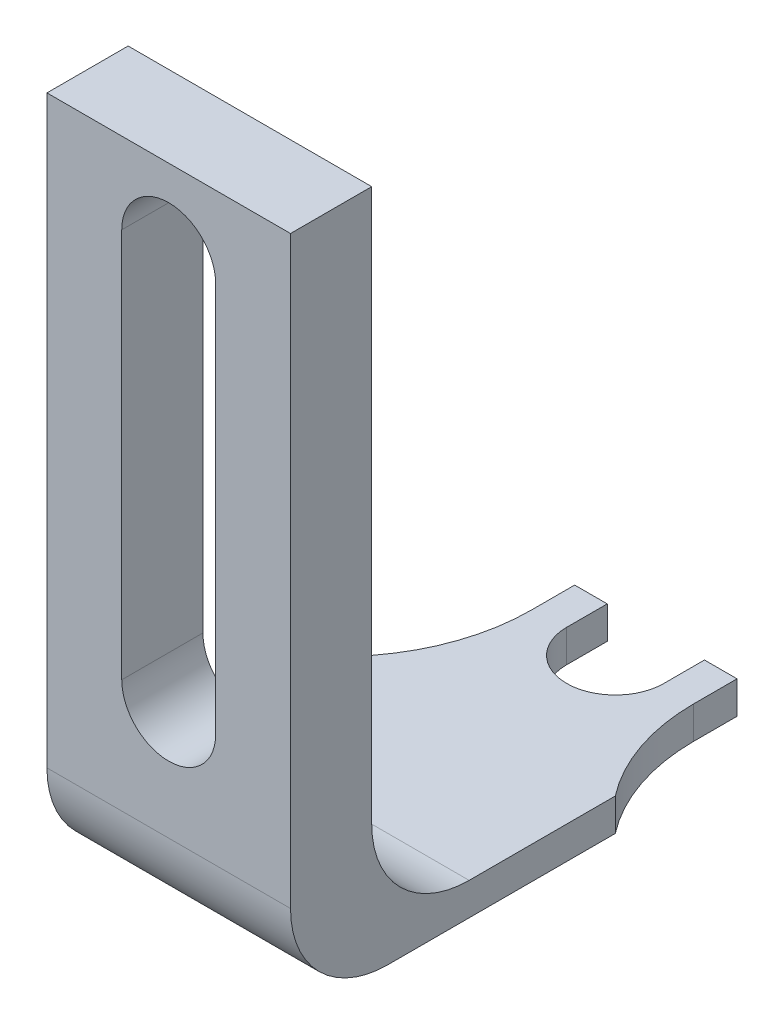
ISO-10303-21;
HEADER;
FILE_DESCRIPTION(('STEP AP214'),'2;1');
FILE_NAME('part.step','',(''),(''),'','','');
FILE_SCHEMA(('AUTOMOTIVE_DESIGN { 1 0 10303 214 1 1 1 1 }'));
ENDSEC;
DATA;
#1=APPLICATION_CONTEXT('core data for automotive mechanical design processes');
#2=APPLICATION_PROTOCOL_DEFINITION('international standard','automotive_design',2000,#1);
#3=PRODUCT_CONTEXT('',#1,'mechanical');
#4=PRODUCT('Part','Part','',(#3));
#5=PRODUCT_RELATED_PRODUCT_CATEGORY('part','',(#4));
#6=PRODUCT_DEFINITION_FORMATION('','',#4);
#7=PRODUCT_DEFINITION_CONTEXT('part definition',#1,'design');
#8=PRODUCT_DEFINITION('design','',#6,#7);
#9=PRODUCT_DEFINITION_SHAPE('','',#8);
#10=(LENGTH_UNIT() NAMED_UNIT(*) SI_UNIT(.MILLI.,.METRE.));
#11=(NAMED_UNIT(*) PLANE_ANGLE_UNIT() SI_UNIT($,.RADIAN.));
#12=(NAMED_UNIT(*) SI_UNIT($,.STERADIAN.) SOLID_ANGLE_UNIT());
#13=UNCERTAINTY_MEASURE_WITH_UNIT(LENGTH_MEASURE(1.E-05),#10,'distance_accuracy_value','');
#14=(GEOMETRIC_REPRESENTATION_CONTEXT(3) GLOBAL_UNCERTAINTY_ASSIGNED_CONTEXT((#13)) GLOBAL_UNIT_ASSIGNED_CONTEXT((#10,
#11,#12)) REPRESENTATION_CONTEXT('',''));
#15=CARTESIAN_POINT('',(0.,0.,0.));
#16=DIRECTION('',(0.,0.,1.));
#17=DIRECTION('',(1.,0.,0.));
#18=AXIS2_PLACEMENT_3D('',#15,#16,#17);
#19=CARTESIAN_POINT('',(6.34999999999999,13.54,0.));
#20=DIRECTION('',(0.,0.,1.));
#21=DIRECTION('',(1.,0.,0.));
#22=AXIS2_PLACEMENT_3D('',#19,#20,#21);
#23=PLANE('',#22);
#24=DIRECTION('',(-1.,0.,0.));
#25=VECTOR('',#24,1.);
#26=CARTESIAN_POINT('',(6.34999999999999,11.,0.));
#27=LINE('',#26,#25);
#28=CARTESIAN_POINT('',(6.34999999999999,11.,0.));
#29=VERTEX_POINT('',#28);
#30=CARTESIAN_POINT('',(3.80199899999999,11.,0.));
#31=VERTEX_POINT('',#30);
#32=EDGE_CURVE('E249',#29,#31,#27,.T.);
#33=ORIENTED_EDGE('',*,*,#32,.T.);
#34=DIRECTION('',(0.,-1.,0.));
#35=VECTOR('',#34,1.);
#36=CARTESIAN_POINT('',(3.80199899999999,13.54,0.));
#37=LINE('',#36,#35);
#38=CARTESIAN_POINT('',(3.80199899999999,13.54,0.));
#39=VERTEX_POINT('',#38);
#40=EDGE_CURVE('E298',#39,#31,#37,.T.);
#41=ORIENTED_EDGE('',*,*,#40,.F.);
#42=DIRECTION('',(-1.,0.,0.));
#43=VECTOR('',#42,1.);
#44=CARTESIAN_POINT('',(6.34999999999999,13.54,0.));
#45=LINE('',#44,#43);
#46=CARTESIAN_POINT('',(6.34999999999999,13.54,0.));
#47=VERTEX_POINT('',#46);
#48=EDGE_CURVE('E252',#47,#39,#45,.T.);
#49=ORIENTED_EDGE('',*,*,#48,.F.);
#50=DIRECTION('',(0.,-1.,0.));
#51=VECTOR('',#50,1.);
#52=CARTESIAN_POINT('',(6.34999999999999,13.54,0.));
#53=LINE('',#52,#51);
#54=EDGE_CURVE('E269',#47,#29,#53,.T.);
#55=ORIENTED_EDGE('',*,*,#54,.T.);
#56=EDGE_LOOP('',(#33,#41,#49,#55));
#57=FACE_BOUND('',#56,.T.);
#58=ADVANCED_FACE('F42',(#57),#23,.F.);
#59=CARTESIAN_POINT('',(3.80199899999999,13.54,0.));
#60=DIRECTION('',(1.,0.,0.));
#61=DIRECTION('',(0.,1.,0.));
#62=AXIS2_PLACEMENT_3D('',#59,#60,#61);
#63=PLANE('',#62);
#64=DIRECTION('',(0.,0.,1.));
#65=VECTOR('',#64,1.);
#66=CARTESIAN_POINT('',(3.80199899999999,11.,0.));
#67=LINE('',#66,#65);
#68=CARTESIAN_POINT('',(3.80199899999999,11.,3.175));
#69=VERTEX_POINT('',#68);
#70=EDGE_CURVE('E272',#31,#69,#67,.T.);
#71=ORIENTED_EDGE('',*,*,#70,.T.);
#72=DIRECTION('',(0.,-1.,0.));
#73=VECTOR('',#72,1.);
#74=CARTESIAN_POINT('',(3.80199899999999,13.54,3.175));
#75=LINE('',#74,#73);
#76=CARTESIAN_POINT('',(3.80199899999999,13.54,3.175));
#77=VERTEX_POINT('',#76);
#78=EDGE_CURVE('E295',#77,#69,#75,.T.);
#79=ORIENTED_EDGE('',*,*,#78,.F.);
#80=DIRECTION('',(0.,0.,1.));
#81=VECTOR('',#80,1.);
#82=CARTESIAN_POINT('',(3.80199899999999,13.54,0.));
#83=LINE('',#82,#81);
#84=EDGE_CURVE('E255',#39,#77,#83,.T.);
#85=ORIENTED_EDGE('',*,*,#84,.F.);
#86=ORIENTED_EDGE('',*,*,#40,.T.);
#87=EDGE_LOOP('',(#71,#79,#85,#86));
#88=FACE_BOUND('',#87,.T.);
#89=ADVANCED_FACE('F385',(#88),#63,.F.);
#90=CARTESIAN_POINT('',(0.,13.54,3.175));
#91=DIRECTION('',(0.,-1.,0.));
#92=DIRECTION('',(1.,0.,0.));
#93=AXIS2_PLACEMENT_3D('',#90,#91,#92);
#94=CYLINDRICAL_SURFACE('',#93,3.80199899999999);
#95=CARTESIAN_POINT('',(0.,11.,3.175));
#96=DIRECTION('',(0.,-1.,0.));
#97=DIRECTION('',(-1.,0.,0.));
#98=AXIS2_PLACEMENT_3D('',#95,#96,#97);
#99=CIRCLE('',#98,3.80199899999999);
#100=CARTESIAN_POINT('',(-3.801999,11.,3.175));
#101=VERTEX_POINT('',#100);
#102=EDGE_CURVE('E274',#69,#101,#99,.T.);
#103=ORIENTED_EDGE('',*,*,#102,.T.);
#104=DIRECTION('',(0.,-1.,0.));
#105=VECTOR('',#104,1.);
#106=CARTESIAN_POINT('',(-3.801999,13.54,3.175));
#107=LINE('',#106,#105);
#108=CARTESIAN_POINT('',(-3.801999,13.54,3.175));
#109=VERTEX_POINT('',#108);
#110=EDGE_CURVE('E292',#109,#101,#107,.T.);
#111=ORIENTED_EDGE('',*,*,#110,.F.);
#112=CARTESIAN_POINT('',(0.,13.54,3.175));
#113=DIRECTION('',(0.,-1.,0.));
#114=DIRECTION('',(-1.,0.,0.));
#115=AXIS2_PLACEMENT_3D('',#112,#113,#114);
#116=CIRCLE('',#115,3.80199899999999);
#117=EDGE_CURVE('E258',#77,#109,#116,.T.);
#118=ORIENTED_EDGE('',*,*,#117,.F.);
#119=ORIENTED_EDGE('',*,*,#78,.T.);
#120=EDGE_LOOP('',(#103,#111,#118,#119));
#121=FACE_BOUND('',#120,.T.);
#122=ADVANCED_FACE('F388',(#121),#94,.F.);
#123=CARTESIAN_POINT('',(-3.801999,13.54,0.));
#124=DIRECTION('',(-1.,0.,0.));
#125=DIRECTION('',(0.,-1.,0.));
#126=AXIS2_PLACEMENT_3D('',#123,#124,#125);
#127=PLANE('',#126);
#128=DIRECTION('',(0.,0.,-1.));
#129=VECTOR('',#128,1.);
#130=CARTESIAN_POINT('',(-3.801999,11.,0.));
#131=LINE('',#130,#129);
#132=CARTESIAN_POINT('',(-3.801999,11.,0.));
#133=VERTEX_POINT('',#132);
#134=EDGE_CURVE('E276',#101,#133,#131,.T.);
#135=ORIENTED_EDGE('',*,*,#134,.T.);
#136=DIRECTION('',(0.,-1.,0.));
#137=VECTOR('',#136,1.);
#138=CARTESIAN_POINT('',(-3.801999,13.54,0.));
#139=LINE('',#138,#137);
#140=CARTESIAN_POINT('',(-3.801999,13.54,0.));
#141=VERTEX_POINT('',#140);
#142=EDGE_CURVE('E289',#141,#133,#139,.T.);
#143=ORIENTED_EDGE('',*,*,#142,.F.);
#144=DIRECTION('',(0.,0.,-1.));
#145=VECTOR('',#144,1.);
#146=CARTESIAN_POINT('',(-3.801999,13.54,0.));
#147=LINE('',#146,#145);
#148=EDGE_CURVE('E260',#109,#141,#147,.T.);
#149=ORIENTED_EDGE('',*,*,#148,.F.);
#150=ORIENTED_EDGE('',*,*,#110,.T.);
#151=EDGE_LOOP('',(#135,#143,#149,#150));
#152=FACE_BOUND('',#151,.T.);
#153=ADVANCED_FACE('F393',(#152),#127,.F.);
#154=CARTESIAN_POINT('',(-3.801999,13.54,0.));
#155=DIRECTION('',(0.,0.,1.));
#156=DIRECTION('',(1.,0.,0.));
#157=AXIS2_PLACEMENT_3D('',#154,#155,#156);
#158=PLANE('',#157);
#159=DIRECTION('',(-1.,0.,0.));
#160=VECTOR('',#159,1.);
#161=CARTESIAN_POINT('',(-3.801999,11.,0.));
#162=LINE('',#161,#160);
#163=CARTESIAN_POINT('',(-6.35,11.,0.));
#164=VERTEX_POINT('',#163);
#165=EDGE_CURVE('E278',#133,#164,#162,.T.);
#166=ORIENTED_EDGE('',*,*,#165,.T.);
#167=DIRECTION('',(0.,-1.,0.));
#168=VECTOR('',#167,1.);
#169=CARTESIAN_POINT('',(-6.35000000000001,13.54,0.));
#170=LINE('',#169,#168);
#171=CARTESIAN_POINT('',(-6.35000000000001,13.54,0.));
#172=VERTEX_POINT('',#171);
#173=EDGE_CURVE('E286',#172,#164,#170,.T.);
#174=ORIENTED_EDGE('',*,*,#173,.F.);
#175=DIRECTION('',(-1.,0.,0.));
#176=VECTOR('',#175,1.);
#177=CARTESIAN_POINT('',(-3.801999,13.54,0.));
#178=LINE('',#177,#176);
#179=EDGE_CURVE('E262',#141,#172,#178,.T.);
#180=ORIENTED_EDGE('',*,*,#179,.F.);
#181=ORIENTED_EDGE('',*,*,#142,.T.);
#182=EDGE_LOOP('',(#166,#174,#180,#181));
#183=FACE_BOUND('',#182,.T.);
#184=ADVANCED_FACE('F397',(#183),#158,.F.);
#185=CARTESIAN_POINT('',(-6.35000000000001,13.54,0.));
#186=DIRECTION('',(1.,0.,0.));
#187=DIRECTION('',(0.,1.,0.));
#188=AXIS2_PLACEMENT_3D('',#185,#186,#187);
#189=PLANE('',#188);
#190=DIRECTION('',(0.,0.,1.));
#191=VECTOR('',#190,1.);
#192=CARTESIAN_POINT('',(-6.35,11.,0.));
#193=LINE('',#192,#191);
#194=CARTESIAN_POINT('',(-6.35,11.,3.38907228037936));
#195=VERTEX_POINT('',#194);
#196=EDGE_CURVE('E280',#164,#195,#193,.T.);
#197=ORIENTED_EDGE('',*,*,#196,.T.);
#198=DIRECTION('',(0.,1.,0.));
#199=VECTOR('',#198,1.);
#200=CARTESIAN_POINT('',(-6.35000000000001,13.54,3.38907228037936));
#201=LINE('',#200,#199);
#202=CARTESIAN_POINT('',(-6.35000000000001,13.54,3.38907228037936));
#203=VERTEX_POINT('',#202);
#204=EDGE_CURVE('E304',#195,#203,#201,.T.);
#205=ORIENTED_EDGE('',*,*,#204,.T.);
#206=DIRECTION('',(0.,0.,1.));
#207=VECTOR('',#206,1.);
#208=CARTESIAN_POINT('',(-6.35000000000001,13.54,0.));
#209=LINE('',#208,#207);
#210=EDGE_CURVE('E264',#172,#203,#209,.T.);
#211=ORIENTED_EDGE('',*,*,#210,.F.);
#212=ORIENTED_EDGE('',*,*,#173,.T.);
#213=EDGE_LOOP('',(#197,#205,#211,#212));
#214=FACE_BOUND('',#213,.T.);
#215=ADVANCED_FACE('F400',(#214),#189,.F.);
#216=CARTESIAN_POINT('',(6.35,13.54,12.7));
#217=DIRECTION('',(-1.,0.,0.));
#218=DIRECTION('',(0.,-1.,0.));
#219=AXIS2_PLACEMENT_3D('',#216,#217,#218);
#220=PLANE('',#219);
#221=DIRECTION('',(0.,0.,-1.));
#222=VECTOR('',#221,1.);
#223=CARTESIAN_POINT('',(6.35,13.54,12.7));
#224=LINE('',#223,#222);
#225=CARTESIAN_POINT('',(6.34999999999999,13.54,3.38907228037936));
#226=VERTEX_POINT('',#225);
#227=EDGE_CURVE('E267',#226,#47,#224,.T.);
#228=ORIENTED_EDGE('',*,*,#227,.F.);
#229=DIRECTION('',(0.,-1.,0.));
#230=VECTOR('',#229,1.);
#231=CARTESIAN_POINT('',(6.34999999999999,13.54,3.38907228037936));
#232=LINE('',#231,#230);
#233=CARTESIAN_POINT('',(6.35,11.,3.38907228037936));
#234=VERTEX_POINT('',#233);
#235=EDGE_CURVE('E301',#226,#234,#232,.T.);
#236=ORIENTED_EDGE('',*,*,#235,.T.);
#237=DIRECTION('',(0.,0.,-1.));
#238=VECTOR('',#237,1.);
#239=CARTESIAN_POINT('',(6.35,11.,12.7));
#240=LINE('',#239,#238);
#241=EDGE_CURVE('E256',#234,#29,#240,.T.);
#242=ORIENTED_EDGE('',*,*,#241,.T.);
#243=ORIENTED_EDGE('',*,*,#54,.F.);
#244=EDGE_LOOP('',(#228,#236,#242,#243));
#245=FACE_BOUND('',#244,.T.);
#246=ADVANCED_FACE('F377',(#245),#220,.F.);
#247=CARTESIAN_POINT('',(0.,13.54,3.175));
#248=DIRECTION('',(0.,1.,0.));
#249=DIRECTION('',(-1.,0.,0.));
#250=AXIS2_PLACEMENT_3D('',#247,#248,#249);
#251=PLANE('',#250);
#252=DIRECTION('',(0.,0.,1.));
#253=VECTOR('',#252,1.);
#254=CARTESIAN_POINT('',(-9.525,13.54,31.75));
#255=LINE('',#254,#253);
#256=CARTESIAN_POINT('',(-9.525,13.54,12.7));
#257=VERTEX_POINT('',#256);
#258=CARTESIAN_POINT('',(-9.525,13.54,24.13));
#259=VERTEX_POINT('',#258);
#260=EDGE_CURVE('E235',#257,#259,#255,.T.);
#261=ORIENTED_EDGE('',*,*,#260,.T.);
#262=DIRECTION('',(1.,0.,0.));
#263=VECTOR('',#262,1.);
#264=CARTESIAN_POINT('',(9.525,13.54,24.13));
#265=LINE('',#264,#263);
#266=CARTESIAN_POINT('',(9.525,13.54,24.13));
#267=VERTEX_POINT('',#266);
#268=EDGE_CURVE('E324',#259,#267,#265,.T.);
#269=ORIENTED_EDGE('',*,*,#268,.T.);
#270=DIRECTION('',(0.,0.,-1.));
#271=VECTOR('',#270,1.);
#272=CARTESIAN_POINT('',(9.525,13.54,31.75));
#273=LINE('',#272,#271);
#274=CARTESIAN_POINT('',(9.525,13.54,12.7));
#275=VERTEX_POINT('',#274);
#276=EDGE_CURVE('E240',#267,#275,#273,.T.);
#277=ORIENTED_EDGE('',*,*,#276,.T.);
#278=CARTESIAN_POINT('',(21.59,13.54,3.38907228037936));
#279=DIRECTION('',(0.,1.,0.));
#280=DIRECTION('',(-1.,0.,0.));
#281=AXIS2_PLACEMENT_3D('',#278,#279,#280);
#282=CIRCLE('',#281,15.24);
#283=EDGE_CURVE('E309',#275,#226,#282,.F.);
#284=ORIENTED_EDGE('',*,*,#283,.T.);
#285=ORIENTED_EDGE('',*,*,#227,.T.);
#286=ORIENTED_EDGE('',*,*,#48,.T.);
#287=ORIENTED_EDGE('',*,*,#84,.T.);
#288=ORIENTED_EDGE('',*,*,#117,.T.);
#289=ORIENTED_EDGE('',*,*,#148,.T.);
#290=ORIENTED_EDGE('',*,*,#179,.T.);
#291=ORIENTED_EDGE('',*,*,#210,.T.);
#292=CARTESIAN_POINT('',(-21.59,13.54,3.38907228037936));
#293=DIRECTION('',(0.,1.,0.));
#294=DIRECTION('',(-1.,0.,0.));
#295=AXIS2_PLACEMENT_3D('',#292,#293,#294);
#296=CIRCLE('',#295,15.24);
#297=EDGE_CURVE('E313',#203,#257,#296,.F.);
#298=ORIENTED_EDGE('',*,*,#297,.T.);
#299=EDGE_LOOP('',(#261,#269,#277,#284,#285,#286,#287,#288,#289,#290,#291,#298));
#300=FACE_BOUND('',#299,.T.);
#301=ADVANCED_FACE('F347',(#300),#251,.T.);
#302=CARTESIAN_POINT('',(0.,11.,3.175));
#303=DIRECTION('',(0.,1.,0.));
#304=DIRECTION('',(-1.,0.,0.));
#305=AXIS2_PLACEMENT_3D('',#302,#303,#304);
#306=PLANE('',#305);
#307=DIRECTION('',(0.,0.,-1.));
#308=VECTOR('',#307,1.);
#309=CARTESIAN_POINT('',(9.525,11.,31.75));
#310=LINE('',#309,#308);
#311=CARTESIAN_POINT('',(9.525,11.,30.48));
#312=VERTEX_POINT('',#311);
#313=CARTESIAN_POINT('',(9.525,11.,12.7));
#314=VERTEX_POINT('',#313);
#315=EDGE_CURVE('E239',#312,#314,#310,.T.);
#316=ORIENTED_EDGE('',*,*,#315,.F.);
#317=DIRECTION('',(1.,0.,0.));
#318=VECTOR('',#317,1.);
#319=CARTESIAN_POINT('',(-9.525,11.,30.48));
#320=LINE('',#319,#318);
#321=CARTESIAN_POINT('',(-9.525,11.,30.48));
#322=VERTEX_POINT('',#321);
#323=EDGE_CURVE('E320',#312,#322,#320,.F.);
#324=ORIENTED_EDGE('',*,*,#323,.T.);
#325=DIRECTION('',(0.,0.,1.));
#326=VECTOR('',#325,1.);
#327=CARTESIAN_POINT('',(-9.525,11.,31.75));
#328=LINE('',#327,#326);
#329=CARTESIAN_POINT('',(-9.525,11.,12.7));
#330=VERTEX_POINT('',#329);
#331=EDGE_CURVE('E236',#330,#322,#328,.T.);
#332=ORIENTED_EDGE('',*,*,#331,.F.);
#333=CARTESIAN_POINT('',(-21.59,11.,3.38907228037936));
#334=DIRECTION('',(0.,1.,0.));
#335=DIRECTION('',(-1.,0.,0.));
#336=AXIS2_PLACEMENT_3D('',#333,#334,#335);
#337=CIRCLE('',#336,15.24);
#338=EDGE_CURVE('E311',#330,#195,#337,.T.);
#339=ORIENTED_EDGE('',*,*,#338,.T.);
#340=ORIENTED_EDGE('',*,*,#196,.F.);
#341=ORIENTED_EDGE('',*,*,#165,.F.);
#342=ORIENTED_EDGE('',*,*,#134,.F.);
#343=ORIENTED_EDGE('',*,*,#102,.F.);
#344=ORIENTED_EDGE('',*,*,#70,.F.);
#345=ORIENTED_EDGE('',*,*,#32,.F.);
#346=ORIENTED_EDGE('',*,*,#241,.F.);
#347=CARTESIAN_POINT('',(21.59,11.,3.38907228037936));
#348=DIRECTION('',(0.,1.,0.));
#349=DIRECTION('',(-1.,0.,0.));
#350=AXIS2_PLACEMENT_3D('',#347,#348,#349);
#351=CIRCLE('',#350,15.24);
#352=EDGE_CURVE('E306',#234,#314,#351,.T.);
#353=ORIENTED_EDGE('',*,*,#352,.T.);
#354=EDGE_LOOP('',(#316,#324,#332,#339,#340,#341,#342,#343,#344,#345,#346,#353));
#355=FACE_BOUND('',#354,.T.);
#356=ADVANCED_FACE('F357',(#355),#306,.F.);
#357=CARTESIAN_POINT('',(-9.525,11.,31.75));
#358=DIRECTION('',(-1.,0.,0.));
#359=DIRECTION('',(0.,-1.,0.));
#360=AXIS2_PLACEMENT_3D('',#357,#358,#359);
#361=PLANE('',#360);
#362=ORIENTED_EDGE('',*,*,#331,.T.);
#363=CARTESIAN_POINT('',(-9.52500000000001,18.62,30.48));
#364=DIRECTION('',(-1.,0.,0.));
#365=DIRECTION('',(0.,-1.,0.));
#366=AXIS2_PLACEMENT_3D('',#363,#364,#365);
#367=CIRCLE('',#366,7.62);
#368=CARTESIAN_POINT('',(-9.52500000000001,18.62,38.1));
#369=VERTEX_POINT('',#368);
#370=EDGE_CURVE('E322',#322,#369,#367,.T.);
#371=ORIENTED_EDGE('',*,*,#370,.T.);
#372=DIRECTION('',(0.,-1.,0.));
#373=VECTOR('',#372,1.);
#374=CARTESIAN_POINT('',(-9.52500000000001,11.,38.1));
#375=LINE('',#374,#373);
#376=CARTESIAN_POINT('',(-9.52500000000003,64.34,38.1));
#377=VERTEX_POINT('',#376);
#378=EDGE_CURVE('E229',#377,#369,#375,.T.);
#379=ORIENTED_EDGE('',*,*,#378,.F.);
#380=DIRECTION('',(0.,0.,1.));
#381=VECTOR('',#380,1.);
#382=CARTESIAN_POINT('',(-9.52500000000003,64.34,38.1));
#383=LINE('',#382,#381);
#384=CARTESIAN_POINT('',(-9.52500000000003,64.34,31.75));
#385=VERTEX_POINT('',#384);
#386=EDGE_CURVE('E218',#385,#377,#383,.T.);
#387=ORIENTED_EDGE('',*,*,#386,.F.);
#388=DIRECTION('',(0.,1.,0.));
#389=VECTOR('',#388,1.);
#390=CARTESIAN_POINT('',(-9.52500000000003,64.34,31.75));
#391=LINE('',#390,#389);
#392=CARTESIAN_POINT('',(-9.52500000000001,21.16,31.75));
#393=VERTEX_POINT('',#392);
#394=EDGE_CURVE('E226',#393,#385,#391,.T.);
#395=ORIENTED_EDGE('',*,*,#394,.F.);
#396=CARTESIAN_POINT('',(-9.52500000000001,21.16,24.13));
#397=DIRECTION('',(-1.,0.,0.));
#398=DIRECTION('',(0.,-1.,0.));
#399=AXIS2_PLACEMENT_3D('',#396,#397,#398);
#400=CIRCLE('',#399,7.62);
#401=EDGE_CURVE('E11',#393,#259,#400,.F.);
#402=ORIENTED_EDGE('',*,*,#401,.T.);
#403=ORIENTED_EDGE('',*,*,#260,.F.);
#404=DIRECTION('',(0.,1.,0.));
#405=VECTOR('',#404,1.);
#406=CARTESIAN_POINT('',(-9.525,11.,12.7));
#407=LINE('',#406,#405);
#408=EDGE_CURVE('E246',#330,#257,#407,.T.);
#409=ORIENTED_EDGE('',*,*,#408,.F.);
#410=EDGE_LOOP('',(#362,#371,#379,#387,#395,#402,#403,#409));
#411=FACE_BOUND('',#410,.T.);
#412=ADVANCED_FACE('F343',(#411),#361,.T.);
#413=CARTESIAN_POINT('',(9.525,11.,31.75));
#414=DIRECTION('',(1.,0.,0.));
#415=DIRECTION('',(0.,1.,0.));
#416=AXIS2_PLACEMENT_3D('',#413,#414,#415);
#417=PLANE('',#416);
#418=DIRECTION('',(0.,-1.,0.));
#419=VECTOR('',#418,1.);
#420=CARTESIAN_POINT('',(9.525,11.,38.1));
#421=LINE('',#420,#419);
#422=CARTESIAN_POINT('',(9.52499999999998,64.34,38.1));
#423=VERTEX_POINT('',#422);
#424=CARTESIAN_POINT('',(9.525,18.62,38.1));
#425=VERTEX_POINT('',#424);
#426=EDGE_CURVE('E215',#423,#425,#421,.T.);
#427=ORIENTED_EDGE('',*,*,#426,.T.);
#428=CARTESIAN_POINT('',(9.52500000000001,18.62,30.48));
#429=DIRECTION('',(1.,0.,0.));
#430=DIRECTION('',(0.,1.,0.));
#431=AXIS2_PLACEMENT_3D('',#428,#429,#430);
#432=CIRCLE('',#431,7.62);
#433=EDGE_CURVE('E318',#425,#312,#432,.T.);
#434=ORIENTED_EDGE('',*,*,#433,.T.);
#435=ORIENTED_EDGE('',*,*,#315,.T.);
#436=DIRECTION('',(0.,1.,0.));
#437=VECTOR('',#436,1.);
#438=CARTESIAN_POINT('',(9.525,11.,12.7));
#439=LINE('',#438,#437);
#440=EDGE_CURVE('E242',#314,#275,#439,.T.);
#441=ORIENTED_EDGE('',*,*,#440,.T.);
#442=ORIENTED_EDGE('',*,*,#276,.F.);
#443=CARTESIAN_POINT('',(9.52499999999999,21.16,24.13));
#444=DIRECTION('',(1.,0.,0.));
#445=DIRECTION('',(0.,1.,0.));
#446=AXIS2_PLACEMENT_3D('',#443,#444,#445);
#447=CIRCLE('',#446,7.62);
#448=CARTESIAN_POINT('',(9.525,21.16,31.75));
#449=VERTEX_POINT('',#448);
#450=EDGE_CURVE('E50',#267,#449,#447,.F.);
#451=ORIENTED_EDGE('',*,*,#450,.T.);
#452=DIRECTION('',(0.,1.,0.));
#453=VECTOR('',#452,1.);
#454=CARTESIAN_POINT('',(9.52499999999998,64.34,31.75));
#455=LINE('',#454,#453);
#456=CARTESIAN_POINT('',(9.52499999999998,64.34,31.75));
#457=VERTEX_POINT('',#456);
#458=EDGE_CURVE('E211',#449,#457,#455,.T.);
#459=ORIENTED_EDGE('',*,*,#458,.T.);
#460=DIRECTION('',(0.,0.,1.));
#461=VECTOR('',#460,1.);
#462=CARTESIAN_POINT('',(9.52499999999998,64.34,38.1));
#463=LINE('',#462,#461);
#464=EDGE_CURVE('E219',#457,#423,#463,.T.);
#465=ORIENTED_EDGE('',*,*,#464,.T.);
#466=EDGE_LOOP('',(#427,#434,#435,#441,#442,#451,#459,#465));
#467=FACE_BOUND('',#466,.T.);
#468=ADVANCED_FACE('F331',(#467),#417,.T.);
#469=CARTESIAN_POINT('',(21.59,11.,3.38907228037936));
#470=DIRECTION('',(0.,-1.,0.));
#471=DIRECTION('',(1.,0.,0.));
#472=AXIS2_PLACEMENT_3D('',#469,#470,#471);
#473=CYLINDRICAL_SURFACE('',#472,15.24);
#474=ORIENTED_EDGE('',*,*,#283,.F.);
#475=ORIENTED_EDGE('',*,*,#440,.F.);
#476=ORIENTED_EDGE('',*,*,#352,.F.);
#477=ORIENTED_EDGE('',*,*,#235,.F.);
#478=EDGE_LOOP('',(#474,#475,#476,#477));
#479=FACE_BOUND('',#478,.T.);
#480=ADVANCED_FACE('F373',(#479),#473,.F.);
#481=CARTESIAN_POINT('',(-21.59,11.,3.38907228037936));
#482=DIRECTION('',(0.,1.,0.));
#483=DIRECTION('',(-1.,0.,0.));
#484=AXIS2_PLACEMENT_3D('',#481,#482,#483);
#485=CYLINDRICAL_SURFACE('',#484,15.24);
#486=ORIENTED_EDGE('',*,*,#297,.F.);
#487=ORIENTED_EDGE('',*,*,#204,.F.);
#488=ORIENTED_EDGE('',*,*,#338,.F.);
#489=ORIENTED_EDGE('',*,*,#408,.T.);
#490=EDGE_LOOP('',(#486,#487,#488,#489));
#491=FACE_BOUND('',#490,.T.);
#492=ADVANCED_FACE('F352',(#491),#485,.F.);
#493=CARTESIAN_POINT('',(-63.2416463956938,64.34,31.75));
#494=DIRECTION('',(0.,0.,-1.));
#495=DIRECTION('',(0.,1.,0.));
#496=AXIS2_PLACEMENT_3D('',#493,#494,#495);
#497=PLANE('',#496);
#498=CARTESIAN_POINT('',(0.,57.99,31.75));
#499=DIRECTION('',(0.,0.,-1.));
#500=DIRECTION('',(0.,1.,0.));
#501=AXIS2_PLACEMENT_3D('',#498,#499,#500);
#502=CIRCLE('',#501,3.675);
#503=CARTESIAN_POINT('',(-3.675,57.99,31.75));
#504=VERTEX_POINT('',#503);
#505=CARTESIAN_POINT('',(3.675,57.99,31.75));
#506=VERTEX_POINT('',#505);
#507=EDGE_CURVE('E57',#504,#506,#502,.T.);
#508=ORIENTED_EDGE('',*,*,#507,.F.);
#509=DIRECTION('',(0.,1.,0.));
#510=VECTOR('',#509,1.);
#511=CARTESIAN_POINT('',(-3.675,57.99,31.75));
#512=LINE('',#511,#510);
#513=CARTESIAN_POINT('',(-3.675,27.51,31.75));
#514=VERTEX_POINT('',#513);
#515=EDGE_CURVE('E196',#514,#504,#512,.T.);
#516=ORIENTED_EDGE('',*,*,#515,.F.);
#517=CARTESIAN_POINT('',(0.,27.51,31.75));
#518=DIRECTION('',(0.,0.,-1.));
#519=DIRECTION('',(0.,1.,0.));
#520=AXIS2_PLACEMENT_3D('',#517,#518,#519);
#521=CIRCLE('',#520,3.675);
#522=CARTESIAN_POINT('',(3.675,27.51,31.75));
#523=VERTEX_POINT('',#522);
#524=EDGE_CURVE('E199',#523,#514,#521,.T.);
#525=ORIENTED_EDGE('',*,*,#524,.F.);
#526=DIRECTION('',(0.,-1.,0.));
#527=VECTOR('',#526,1.);
#528=CARTESIAN_POINT('',(3.675,57.99,31.75));
#529=LINE('',#528,#527);
#530=EDGE_CURVE('E205',#506,#523,#529,.T.);
#531=ORIENTED_EDGE('',*,*,#530,.F.);
#532=EDGE_LOOP('',(#508,#516,#525,#531));
#533=FACE_BOUND('',#532,.T.);
#534=ORIENTED_EDGE('',*,*,#458,.F.);
#535=DIRECTION('',(1.,0.,0.));
#536=VECTOR('',#535,1.);
#537=CARTESIAN_POINT('',(-9.52500000000001,21.16,31.75));
#538=LINE('',#537,#536);
#539=EDGE_CURVE('E327',#449,#393,#538,.F.);
#540=ORIENTED_EDGE('',*,*,#539,.T.);
#541=ORIENTED_EDGE('',*,*,#394,.T.);
#542=DIRECTION('',(1.,0.,0.));
#543=VECTOR('',#542,1.);
#544=CARTESIAN_POINT('',(-63.2416463956938,64.34,31.75));
#545=LINE('',#544,#543);
#546=EDGE_CURVE('E228',#385,#457,#545,.T.);
#547=ORIENTED_EDGE('',*,*,#546,.T.);
#548=EDGE_LOOP('',(#534,#540,#541,#547));
#549=FACE_BOUND('',#548,.T.);
#550=ADVANCED_FACE('F336',(#533,#549),#497,.T.);
#551=CARTESIAN_POINT('',(-63.2416463956938,64.34,38.1));
#552=DIRECTION('',(0.,1.,0.));
#553=DIRECTION('',(-1.,0.,0.));
#554=AXIS2_PLACEMENT_3D('',#551,#552,#553);
#555=PLANE('',#554);
#556=ORIENTED_EDGE('',*,*,#546,.F.);
#557=ORIENTED_EDGE('',*,*,#386,.T.);
#558=DIRECTION('',(1.,0.,0.));
#559=VECTOR('',#558,1.);
#560=CARTESIAN_POINT('',(-63.2416463956938,64.34,38.1));
#561=LINE('',#560,#559);
#562=EDGE_CURVE('E225',#377,#423,#561,.T.);
#563=ORIENTED_EDGE('',*,*,#562,.T.);
#564=ORIENTED_EDGE('',*,*,#464,.F.);
#565=EDGE_LOOP('',(#556,#557,#563,#564));
#566=FACE_BOUND('',#565,.T.);
#567=ADVANCED_FACE('F366',(#566),#555,.T.);
#568=CARTESIAN_POINT('',(-63.2416463956938,11.,38.1));
#569=DIRECTION('',(0.,0.,1.));
#570=DIRECTION('',(1.,0.,0.));
#571=AXIS2_PLACEMENT_3D('',#568,#569,#570);
#572=PLANE('',#571);
#573=CARTESIAN_POINT('',(0.,57.99,38.1));
#574=DIRECTION('',(0.,0.,-1.));
#575=DIRECTION('',(0.,1.,0.));
#576=AXIS2_PLACEMENT_3D('',#573,#574,#575);
#577=CIRCLE('',#576,3.675);
#578=CARTESIAN_POINT('',(-3.675,57.99,38.1));
#579=VERTEX_POINT('',#578);
#580=CARTESIAN_POINT('',(3.675,57.99,38.1));
#581=VERTEX_POINT('',#580);
#582=EDGE_CURVE('E180',#579,#581,#577,.T.);
#583=ORIENTED_EDGE('',*,*,#582,.T.);
#584=DIRECTION('',(0.,-1.,0.));
#585=VECTOR('',#584,1.);
#586=CARTESIAN_POINT('',(3.675,57.99,38.1));
#587=LINE('',#586,#585);
#588=CARTESIAN_POINT('',(3.675,27.51,38.1));
#589=VERTEX_POINT('',#588);
#590=EDGE_CURVE('E189',#581,#589,#587,.T.);
#591=ORIENTED_EDGE('',*,*,#590,.T.);
#592=CARTESIAN_POINT('',(0.,27.51,38.1));
#593=DIRECTION('',(0.,0.,-1.));
#594=DIRECTION('',(0.,1.,0.));
#595=AXIS2_PLACEMENT_3D('',#592,#593,#594);
#596=CIRCLE('',#595,3.675);
#597=CARTESIAN_POINT('',(-3.675,27.51,38.1));
#598=VERTEX_POINT('',#597);
#599=EDGE_CURVE('E65',#589,#598,#596,.T.);
#600=ORIENTED_EDGE('',*,*,#599,.T.);
#601=DIRECTION('',(0.,1.,0.));
#602=VECTOR('',#601,1.);
#603=CARTESIAN_POINT('',(-3.675,57.99,38.1));
#604=LINE('',#603,#602);
#605=EDGE_CURVE('E186',#598,#579,#604,.T.);
#606=ORIENTED_EDGE('',*,*,#605,.T.);
#607=EDGE_LOOP('',(#583,#591,#600,#606));
#608=FACE_BOUND('',#607,.T.);
#609=ORIENTED_EDGE('',*,*,#378,.T.);
#610=DIRECTION('',(1.,0.,0.));
#611=VECTOR('',#610,1.);
#612=CARTESIAN_POINT('',(9.52500000000001,18.62,38.1));
#613=LINE('',#612,#611);
#614=EDGE_CURVE('E315',#369,#425,#613,.T.);
#615=ORIENTED_EDGE('',*,*,#614,.T.);
#616=ORIENTED_EDGE('',*,*,#426,.F.);
#617=ORIENTED_EDGE('',*,*,#562,.F.);
#618=EDGE_LOOP('',(#609,#615,#616,#617));
#619=FACE_BOUND('',#618,.T.);
#620=ADVANCED_FACE('F193',(#608,#619),#572,.T.);
#621=CARTESIAN_POINT('',(-63.2416463956938,18.62,30.48));
#622=DIRECTION('',(-1.,0.,0.));
#623=DIRECTION('',(0.,-1.,0.));
#624=AXIS2_PLACEMENT_3D('',#621,#622,#623);
#625=CYLINDRICAL_SURFACE('',#624,7.62);
#626=ORIENTED_EDGE('',*,*,#370,.F.);
#627=ORIENTED_EDGE('',*,*,#323,.F.);
#628=ORIENTED_EDGE('',*,*,#433,.F.);
#629=ORIENTED_EDGE('',*,*,#614,.F.);
#630=EDGE_LOOP('',(#626,#627,#628,#629));
#631=FACE_BOUND('',#630,.T.);
#632=ADVANCED_FACE('F361',(#631),#625,.T.);
#633=CARTESIAN_POINT('',(0.,21.16,24.13));
#634=DIRECTION('',(-1.,0.,0.));
#635=DIRECTION('',(0.,-1.,0.));
#636=AXIS2_PLACEMENT_3D('',#633,#634,#635);
#637=CYLINDRICAL_SURFACE('',#636,7.62);
#638=ORIENTED_EDGE('',*,*,#401,.F.);
#639=ORIENTED_EDGE('',*,*,#539,.F.);
#640=ORIENTED_EDGE('',*,*,#450,.F.);
#641=ORIENTED_EDGE('',*,*,#268,.F.);
#642=EDGE_LOOP('',(#638,#639,#640,#641));
#643=FACE_BOUND('',#642,.T.);
#644=ADVANCED_FACE('F44',(#643),#637,.F.);
#645=CARTESIAN_POINT('',(0.,57.99,38.1));
#646=DIRECTION('',(0.,0.,-1.));
#647=DIRECTION('',(0.,1.,0.));
#648=AXIS2_PLACEMENT_3D('',#645,#646,#647);
#649=CYLINDRICAL_SURFACE('',#648,3.675);
#650=ORIENTED_EDGE('',*,*,#507,.T.);
#651=DIRECTION('',(0.,0.,-1.));
#652=VECTOR('',#651,1.);
#653=CARTESIAN_POINT('',(3.675,57.99,38.1));
#654=LINE('',#653,#652);
#655=EDGE_CURVE('E176',#581,#506,#654,.T.);
#656=ORIENTED_EDGE('',*,*,#655,.F.);
#657=ORIENTED_EDGE('',*,*,#582,.F.);
#658=DIRECTION('',(0.,0.,-1.));
#659=VECTOR('',#658,1.);
#660=CARTESIAN_POINT('',(-3.675,57.99,38.1));
#661=LINE('',#660,#659);
#662=EDGE_CURVE('E209',#579,#504,#661,.T.);
#663=ORIENTED_EDGE('',*,*,#662,.T.);
#664=EDGE_LOOP('',(#650,#656,#657,#663));
#665=FACE_BOUND('',#664,.T.);
#666=ADVANCED_FACE('F178',(#665),#649,.F.);
#667=CARTESIAN_POINT('',(-3.675,57.99,38.1));
#668=DIRECTION('',(-1.,0.,0.));
#669=DIRECTION('',(0.,-1.,0.));
#670=AXIS2_PLACEMENT_3D('',#667,#668,#669);
#671=PLANE('',#670);
#672=ORIENTED_EDGE('',*,*,#515,.T.);
#673=ORIENTED_EDGE('',*,*,#662,.F.);
#674=ORIENTED_EDGE('',*,*,#605,.F.);
#675=DIRECTION('',(0.,0.,-1.));
#676=VECTOR('',#675,1.);
#677=CARTESIAN_POINT('',(-3.675,27.51,38.1));
#678=LINE('',#677,#676);
#679=EDGE_CURVE('E212',#598,#514,#678,.T.);
#680=ORIENTED_EDGE('',*,*,#679,.T.);
#681=EDGE_LOOP('',(#672,#673,#674,#680));
#682=FACE_BOUND('',#681,.T.);
#683=ADVANCED_FACE('F565',(#682),#671,.F.);
#684=CARTESIAN_POINT('',(0.,27.51,38.1));
#685=DIRECTION('',(0.,0.,-1.));
#686=DIRECTION('',(0.,1.,0.));
#687=AXIS2_PLACEMENT_3D('',#684,#685,#686);
#688=CYLINDRICAL_SURFACE('',#687,3.675);
#689=ORIENTED_EDGE('',*,*,#524,.T.);
#690=ORIENTED_EDGE('',*,*,#679,.F.);
#691=ORIENTED_EDGE('',*,*,#599,.F.);
#692=DIRECTION('',(0.,0.,-1.));
#693=VECTOR('',#692,1.);
#694=CARTESIAN_POINT('',(3.675,27.51,38.1));
#695=LINE('',#694,#693);
#696=EDGE_CURVE('E185',#589,#523,#695,.T.);
#697=ORIENTED_EDGE('',*,*,#696,.T.);
#698=EDGE_LOOP('',(#689,#690,#691,#697));
#699=FACE_BOUND('',#698,.T.);
#700=ADVANCED_FACE('F572',(#699),#688,.F.);
#701=CARTESIAN_POINT('',(3.675,57.99,38.1));
#702=DIRECTION('',(1.,0.,0.));
#703=DIRECTION('',(0.,1.,0.));
#704=AXIS2_PLACEMENT_3D('',#701,#702,#703);
#705=PLANE('',#704);
#706=ORIENTED_EDGE('',*,*,#530,.T.);
#707=ORIENTED_EDGE('',*,*,#696,.F.);
#708=ORIENTED_EDGE('',*,*,#590,.F.);
#709=ORIENTED_EDGE('',*,*,#655,.T.);
#710=EDGE_LOOP('',(#706,#707,#708,#709));
#711=FACE_BOUND('',#710,.T.);
#712=ADVANCED_FACE('F190',(#711),#705,.F.);
#713=CLOSED_SHELL('',(#58,#89,#122,#153,#184,#215,#246,#301,#356,#412,#468,#480,#492,#550,#567,
#620,#632,#644,#666,#683,#700,#712));
#714=MANIFOLD_SOLID_BREP('B2',#713);
#715=ADVANCED_BREP_SHAPE_REPRESENTATION('',(#18,#714),#14);
#716=SHAPE_DEFINITION_REPRESENTATION(#9,#715);
ENDSEC;
END-ISO-10303-21;
